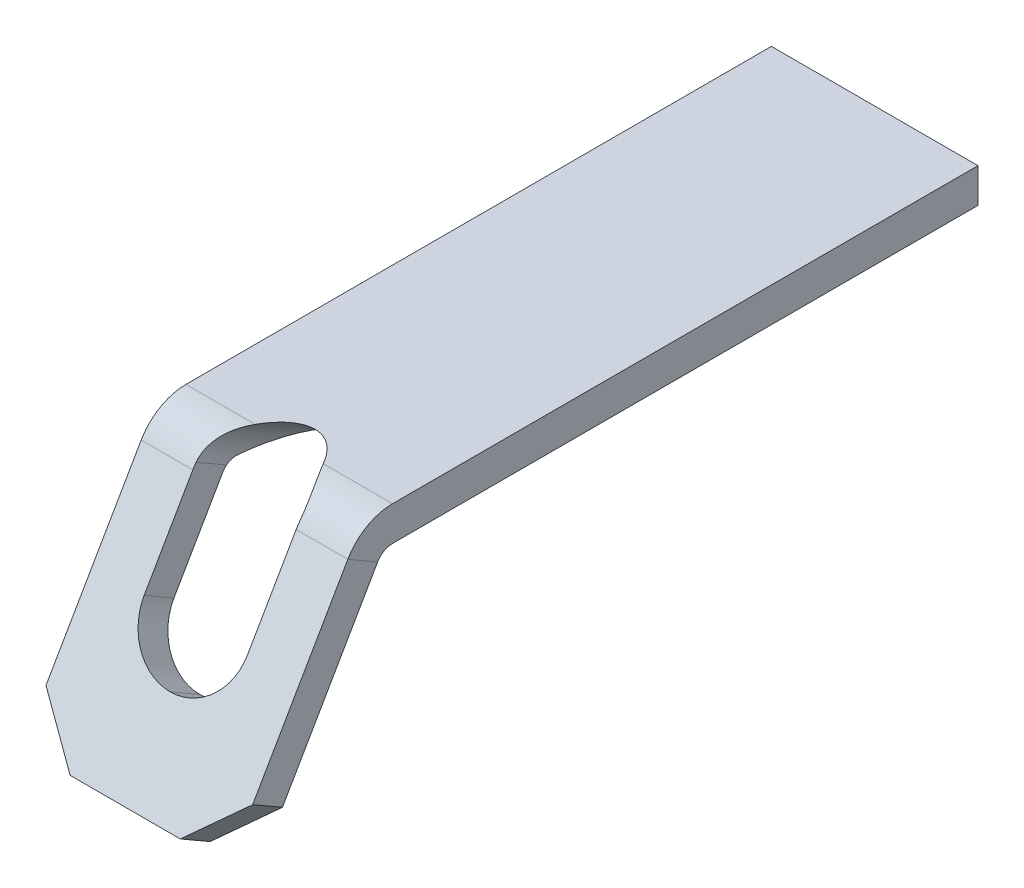
ISO-10303-21;
HEADER;
FILE_DESCRIPTION(('STEP AP214'),'2;1');
FILE_NAME('part.step','',(''),(''),'','','');
FILE_SCHEMA(('AUTOMOTIVE_DESIGN { 1 0 10303 214 1 1 1 1 }'));
ENDSEC;
DATA;
#1=APPLICATION_CONTEXT('core data for automotive mechanical design processes');
#2=APPLICATION_PROTOCOL_DEFINITION('international standard','automotive_design',2000,#1);
#3=PRODUCT_CONTEXT('',#1,'mechanical');
#4=PRODUCT('Part','Part','',(#3));
#5=PRODUCT_RELATED_PRODUCT_CATEGORY('part','',(#4));
#6=PRODUCT_DEFINITION_FORMATION('','',#4);
#7=PRODUCT_DEFINITION_CONTEXT('part definition',#1,'design');
#8=PRODUCT_DEFINITION('design','',#6,#7);
#9=PRODUCT_DEFINITION_SHAPE('','',#8);
#10=(LENGTH_UNIT() NAMED_UNIT(*) SI_UNIT(.MILLI.,.METRE.));
#11=(NAMED_UNIT(*) PLANE_ANGLE_UNIT() SI_UNIT($,.RADIAN.));
#12=(NAMED_UNIT(*) SI_UNIT($,.STERADIAN.) SOLID_ANGLE_UNIT());
#13=UNCERTAINTY_MEASURE_WITH_UNIT(LENGTH_MEASURE(1.E-05),#10,'distance_accuracy_value','');
#14=(GEOMETRIC_REPRESENTATION_CONTEXT(3) GLOBAL_UNCERTAINTY_ASSIGNED_CONTEXT((#13)) GLOBAL_UNIT_ASSIGNED_CONTEXT((#10,
#11,#12)) REPRESENTATION_CONTEXT('',''));
#15=CARTESIAN_POINT('',(0.,0.,0.));
#16=DIRECTION('',(0.,0.,1.));
#17=DIRECTION('',(1.,0.,0.));
#18=AXIS2_PLACEMENT_3D('',#15,#16,#17);
#19=CARTESIAN_POINT('',(-0.8,-3.25,6.41506350946111));
#20=DIRECTION('',(0.707106781186549,0.612372435695793,-0.353553390593274));
#21=DIRECTION('',(0.,-0.5,-0.866025403784438));
#22=AXIS2_PLACEMENT_3D('',#19,#20,#21);
#23=PLANE('',#22);
#24=DIRECTION('',(0.707106781186546,-0.612372435695796,0.353553390593276));
#25=VECTOR('',#24,1.);
#26=CARTESIAN_POINT('',(-1.38205080756888,-2.6209292143521,6.34054445662277));
#27=LINE('',#26,#25);
#28=CARTESIAN_POINT('',(-1.5,-2.51878221735089,6.28156986040721));
#29=VERTEX_POINT('',#28);
#30=CARTESIAN_POINT('',(-0.8,-3.125,6.63156986040721));
#31=VERTEX_POINT('',#30);
#32=EDGE_CURVE('E229',#29,#31,#27,.T.);
#33=ORIENTED_EDGE('',*,*,#32,.F.);
#34=DIRECTION('',(0.,0.5,0.866025403784438));
#35=VECTOR('',#34,1.);
#36=CARTESIAN_POINT('',(-1.5,-2.51878221735089,6.28156986040721));
#37=LINE('',#36,#35);
#38=CARTESIAN_POINT('',(-1.5,-2.76878221735089,5.84855715851499));
#39=VERTEX_POINT('',#38);
#40=EDGE_CURVE('E122',#39,#29,#37,.T.);
#41=ORIENTED_EDGE('',*,*,#40,.F.);
#42=DIRECTION('',(-0.707106781186546,0.612372435695796,-0.353553390593276));
#43=VECTOR('',#42,1.);
#44=CARTESIAN_POINT('',(-2.88205080756888,-1.57189110867544,5.15753175473055));
#45=LINE('',#44,#43);
#46=CARTESIAN_POINT('',(-0.8,-3.375,6.198557158515));
#47=VERTEX_POINT('',#46);
#48=EDGE_CURVE('E232',#47,#39,#45,.T.);
#49=ORIENTED_EDGE('',*,*,#48,.F.);
#50=DIRECTION('',(0.,-0.5,-0.866025403784438));
#51=VECTOR('',#50,1.);
#52=CARTESIAN_POINT('',(-0.8,-3.25,6.41506350946111));
#53=LINE('',#52,#51);
#54=EDGE_CURVE('E227',#31,#47,#53,.T.);
#55=ORIENTED_EDGE('',*,*,#54,.F.);
#56=EDGE_LOOP('',(#33,#41,#49,#55));
#57=FACE_BOUND('',#56,.T.);
#58=ADVANCED_FACE('F17',(#57),#23,.F.);
#59=CARTESIAN_POINT('',(0.8,-3.25,6.41506350946111));
#60=DIRECTION('',(-0.707106781186549,0.612372435695793,-0.353553390593274));
#61=DIRECTION('',(-0.447213595499957,0.,0.894427190999916));
#62=AXIS2_PLACEMENT_3D('',#59,#60,#61);
#63=PLANE('',#62);
#64=DIRECTION('',(-0.707106781186546,-0.612372435695796,0.353553390593276));
#65=VECTOR('',#64,1.);
#66=CARTESIAN_POINT('',(1.38205080756888,-2.8709292143521,5.90753175473055));
#67=LINE('',#66,#65);
#68=CARTESIAN_POINT('',(1.5,-2.76878221735089,5.84855715851499));
#69=VERTEX_POINT('',#68);
#70=CARTESIAN_POINT('',(0.8,-3.375,6.198557158515));
#71=VERTEX_POINT('',#70);
#72=EDGE_CURVE('E268',#69,#71,#67,.T.);
#73=ORIENTED_EDGE('',*,*,#72,.F.);
#74=DIRECTION('',(0.,-0.5,-0.866025403784438));
#75=VECTOR('',#74,1.);
#76=CARTESIAN_POINT('',(1.5,-2.76878221735089,5.84855715851499));
#77=LINE('',#76,#75);
#78=CARTESIAN_POINT('',(1.5,-2.51878221735089,6.28156986040721));
#79=VERTEX_POINT('',#78);
#80=EDGE_CURVE('E244',#79,#69,#77,.T.);
#81=ORIENTED_EDGE('',*,*,#80,.F.);
#82=DIRECTION('',(0.707106781186546,0.612372435695796,-0.353553390593276));
#83=VECTOR('',#82,1.);
#84=CARTESIAN_POINT('',(2.88205080756888,-1.32189110867544,5.59054445662277));
#85=LINE('',#84,#83);
#86=CARTESIAN_POINT('',(0.8,-3.125,6.63156986040721));
#87=VERTEX_POINT('',#86);
#88=EDGE_CURVE('E248',#87,#79,#85,.T.);
#89=ORIENTED_EDGE('',*,*,#88,.F.);
#90=DIRECTION('',(0.,0.5,0.866025403784438));
#91=VECTOR('',#90,1.);
#92=CARTESIAN_POINT('',(0.8,-3.25,6.41506350946111));
#93=LINE('',#92,#91);
#94=EDGE_CURVE('E219',#71,#87,#93,.T.);
#95=ORIENTED_EDGE('',*,*,#94,.F.);
#96=EDGE_LOOP('',(#73,#81,#89,#95));
#97=FACE_BOUND('',#96,.T.);
#98=ADVANCED_FACE('F466',(#97),#63,.F.);
#99=CARTESIAN_POINT('',(-0.75,-4.82496778264912,-3.41286071037125));
#100=DIRECTION('',(-1.,0.,0.));
#101=DIRECTION('',(0.,1.,0.));
#102=AXIS2_PLACEMENT_3D('',#99,#100,#101);
#103=PLANE('',#102);
#104=CARTESIAN_POINT('',(-0.75,-0.5,4.25));
#105=DIRECTION('',(1.,0.,0.));
#106=DIRECTION('',(0.,-1.,0.));
#107=AXIS2_PLACEMENT_3D('',#104,#105,#106);
#108=CIRCLE('',#107,0.75);
#109=CARTESIAN_POINT('',(-0.75,-0.0530774463348061,4.85229580027208));
#110=VERTEX_POINT('',#109);
#111=CARTESIAN_POINT('',(-0.75,-0.125,4.89951905283833));
#112=VERTEX_POINT('',#111);
#113=EDGE_CURVE('E135',#110,#112,#108,.T.);
#114=ORIENTED_EDGE('',*,*,#113,.T.);
#115=DIRECTION('',(0.,-0.866025403784438,0.5));
#116=VECTOR('',#115,1.);
#117=CARTESIAN_POINT('',(-0.75,-0.125,4.89951905283833));
#118=LINE('',#117,#116);
#119=CARTESIAN_POINT('',(-0.75,-1.3496479222419,5.60656986040721));
#120=VERTEX_POINT('',#119);
#121=EDGE_CURVE('E281',#112,#120,#118,.T.);
#122=ORIENTED_EDGE('',*,*,#121,.T.);
#123=DIRECTION('',(0.,0.5,0.866025403784438));
#124=VECTOR('',#123,1.);
#125=CARTESIAN_POINT('',(-0.75,-6.12400588832578,-2.66286071037125));
#126=LINE('',#125,#124);
#127=CARTESIAN_POINT('',(-0.75,-1.5996479222419,5.17355715851499));
#128=VERTEX_POINT('',#127);
#129=EDGE_CURVE('E11',#128,#120,#126,.T.);
#130=ORIENTED_EDGE('',*,*,#129,.F.);
#131=DIRECTION('',(0.,0.866025403784438,-0.5));
#132=VECTOR('',#131,1.);
#133=CARTESIAN_POINT('',(-0.75,-0.375,4.46650635094611));
#134=LINE('',#133,#132);
#135=CARTESIAN_POINT('',(-0.75,-0.375,4.46650635094611));
#136=VERTEX_POINT('',#135);
#137=EDGE_CURVE('E342',#128,#136,#134,.T.);
#138=ORIENTED_EDGE('',*,*,#137,.T.);
#139=CARTESIAN_POINT('',(-0.75,-0.5,4.25));
#140=DIRECTION('',(-1.,0.,0.));
#141=DIRECTION('',(0.,-1.,0.));
#142=AXIS2_PLACEMENT_3D('',#139,#140,#141);
#143=CIRCLE('',#142,0.25);
#144=CARTESIAN_POINT('',(-0.75,-0.308220009215911,4.41037591818866));
#145=VERTEX_POINT('',#144);
#146=EDGE_CURVE('E294',#136,#145,#143,.T.);
#147=ORIENTED_EDGE('',*,*,#146,.T.);
#148=DIRECTION('',(0.,0.5,0.866025403784438));
#149=VECTOR('',#148,1.);
#150=CARTESIAN_POINT('',(-0.75,-4.82496778264912,-3.41286071037125));
#151=LINE('',#150,#149);
#152=EDGE_CURVE('E34',#145,#110,#151,.T.);
#153=ORIENTED_EDGE('',*,*,#152,.T.);
#154=EDGE_LOOP('',(#114,#122,#130,#138,#147,#153));
#155=FACE_BOUND('',#154,.T.);
#156=ADVANCED_FACE('F464',(#155),#103,.F.);
#157=CARTESIAN_POINT('',(0.,-6.12400588832578,-2.66286071037125));
#158=DIRECTION('',(0.,0.5,0.866025403784438));
#159=DIRECTION('',(0.,-0.866025403784438,0.5));
#160=AXIS2_PLACEMENT_3D('',#157,#158,#159);
#161=CYLINDRICAL_SURFACE('',#160,0.75);
#162=DIRECTION('',(0.,0.5,0.866025403784438));
#163=VECTOR('',#162,1.);
#164=CARTESIAN_POINT('',(0.,-6.77352494116411,-2.28786071037125));
#165=LINE('',#164,#163);
#166=CARTESIAN_POINT('',(0.,-2.24916697508023,5.54855715851499));
#167=VERTEX_POINT('',#166);
#168=CARTESIAN_POINT('',(0.,-1.99916697508023,5.98156986040721));
#169=VERTEX_POINT('',#168);
#170=EDGE_CURVE('E269',#167,#169,#165,.T.);
#171=ORIENTED_EDGE('',*,*,#170,.F.);
#172=CARTESIAN_POINT('',(0.,-1.59964792224191,5.17355715851499));
#173=DIRECTION('',(0.,-0.5,-0.866025403784438));
#174=DIRECTION('',(0.,0.866025403784438,-0.5));
#175=AXIS2_PLACEMENT_3D('',#172,#173,#174);
#176=CIRCLE('',#175,0.75);
#177=EDGE_CURVE('E338',#167,#128,#176,.T.);
#178=ORIENTED_EDGE('',*,*,#177,.T.);
#179=ORIENTED_EDGE('',*,*,#129,.T.);
#180=CARTESIAN_POINT('',(0.,-1.3496479222419,5.60656986040721));
#181=DIRECTION('',(0.,0.5,0.866025403784438));
#182=DIRECTION('',(0.,-0.866025403784438,0.5));
#183=AXIS2_PLACEMENT_3D('',#180,#181,#182);
#184=CIRCLE('',#183,0.75);
#185=EDGE_CURVE('E284',#120,#169,#184,.T.);
#186=ORIENTED_EDGE('',*,*,#185,.T.);
#187=EDGE_LOOP('',(#171,#178,#179,#186));
#188=FACE_BOUND('',#187,.T.);
#189=ADVANCED_FACE('F462',(#188),#161,.F.);
#190=CARTESIAN_POINT('',(0.75,-4.82496778264912,-3.41286071037125));
#191=DIRECTION('',(1.,0.,0.));
#192=DIRECTION('',(0.,1.,0.));
#193=AXIS2_PLACEMENT_3D('',#190,#191,#192);
#194=PLANE('',#193);
#195=CARTESIAN_POINT('',(0.75,-0.5,4.25));
#196=DIRECTION('',(-1.,0.,0.));
#197=DIRECTION('',(0.,0.,-1.));
#198=AXIS2_PLACEMENT_3D('',#195,#196,#197);
#199=CIRCLE('',#198,0.75);
#200=CARTESIAN_POINT('',(0.75,-0.125,4.89951905283833));
#201=VERTEX_POINT('',#200);
#202=CARTESIAN_POINT('',(0.75,-0.0530774463348061,4.85229580027208));
#203=VERTEX_POINT('',#202);
#204=EDGE_CURVE('E309',#201,#203,#199,.T.);
#205=ORIENTED_EDGE('',*,*,#204,.T.);
#206=DIRECTION('',(0.,0.5,0.866025403784438));
#207=VECTOR('',#206,1.);
#208=CARTESIAN_POINT('',(0.75,-4.82496778264912,-3.41286071037125));
#209=LINE('',#208,#207);
#210=CARTESIAN_POINT('',(0.75,-0.308220009215911,4.41037591818866));
#211=VERTEX_POINT('',#210);
#212=EDGE_CURVE('E235',#211,#203,#209,.T.);
#213=ORIENTED_EDGE('',*,*,#212,.F.);
#214=CARTESIAN_POINT('',(0.75,-0.5,4.25));
#215=DIRECTION('',(1.,0.,0.));
#216=DIRECTION('',(0.,0.,-1.));
#217=AXIS2_PLACEMENT_3D('',#214,#215,#216);
#218=CIRCLE('',#217,0.25);
#219=CARTESIAN_POINT('',(0.75,-0.375,4.46650635094611));
#220=VERTEX_POINT('',#219);
#221=EDGE_CURVE('E305',#211,#220,#218,.T.);
#222=ORIENTED_EDGE('',*,*,#221,.T.);
#223=DIRECTION('',(0.,-0.866025403784438,0.5));
#224=VECTOR('',#223,1.);
#225=CARTESIAN_POINT('',(0.75,-0.375,4.46650635094611));
#226=LINE('',#225,#224);
#227=CARTESIAN_POINT('',(0.75,-1.59964792224191,5.17355715851499));
#228=VERTEX_POINT('',#227);
#229=EDGE_CURVE('E341',#220,#228,#226,.T.);
#230=ORIENTED_EDGE('',*,*,#229,.T.);
#231=DIRECTION('',(0.,0.5,0.866025403784438));
#232=VECTOR('',#231,1.);
#233=CARTESIAN_POINT('',(0.75,-6.12400588832578,-2.66286071037125));
#234=LINE('',#233,#232);
#235=CARTESIAN_POINT('',(0.75,-1.3496479222419,5.60656986040721));
#236=VERTEX_POINT('',#235);
#237=EDGE_CURVE('E346',#228,#236,#234,.T.);
#238=ORIENTED_EDGE('',*,*,#237,.T.);
#239=DIRECTION('',(0.,0.866025403784438,-0.5));
#240=VECTOR('',#239,1.);
#241=CARTESIAN_POINT('',(0.75,-0.0506098165652452,4.85656986040721));
#242=LINE('',#241,#240);
#243=EDGE_CURVE('E97',#236,#201,#242,.T.);
#244=ORIENTED_EDGE('',*,*,#243,.T.);
#245=EDGE_LOOP('',(#205,#213,#222,#230,#238,#244));
#246=FACE_BOUND('',#245,.T.);
#247=ADVANCED_FACE('F460',(#246),#194,.F.);
#248=CARTESIAN_POINT('',(0.,-4.82496778264912,-3.41286071037125));
#249=DIRECTION('',(0.,0.5,0.866025403784438));
#250=DIRECTION('',(0.,-0.866025403784438,0.5));
#251=AXIS2_PLACEMENT_3D('',#248,#249,#250);
#252=CYLINDRICAL_SURFACE('',#251,0.75);
#253=CARTESIAN_POINT('',(0.738540154084687,-0.25,4.25));
#254=CARTESIAN_POINT('',(0.739796227190585,-0.249992222476748,4.26423192600012));
#255=CARTESIAN_POINT('',(0.741136393695473,-0.251215674942695,4.27845228618072));
#256=CARTESIAN_POINT('',(0.743704492818734,-0.255982139403662,4.30608304503191));
#257=CARTESIAN_POINT('',(0.74493454642555,-0.2594573169147,4.31950497559517));
#258=CARTESIAN_POINT('',(0.747172335123278,-0.268891956089954,4.34646595481917));
#259=CARTESIAN_POINT('',(0.748160348429002,-0.274998607282581,4.35995559261057));
#260=CARTESIAN_POINT('',(0.749588900459598,-0.289725386987503,4.38608332336731));
#261=CARTESIAN_POINT('',(0.750011148585141,-0.298418856822308,4.39868102665239));
#262=CARTESIAN_POINT('',(0.75,-0.308220009215909,4.41037591818866));
#263=B_SPLINE_CURVE_WITH_KNOTS('',3,(#253,#254,#255,#256,#257,#258,#259,#260,#261,#262),
.UNSPECIFIED.,.F.,.F.,(4,2,2,2,4),(0.,0.0428026914059938,0.0843723717900829,0.128652135829097,
0.174331417159321),.UNSPECIFIED.);
#264=CARTESIAN_POINT('',(0.738540154084689,-0.25,4.25));
#265=VERTEX_POINT('',#264);
#266=EDGE_CURVE('E21',#265,#211,#263,.T.);
#267=ORIENTED_EDGE('',*,*,#266,.T.);
#268=ORIENTED_EDGE('',*,*,#212,.T.);
#269=CARTESIAN_POINT('',(0.75,-0.0530774463347974,4.85229580027207));
#270=CARTESIAN_POINT('',(0.750002475309161,-0.0390500007812516,4.84189012408484));
#271=CARTESIAN_POINT('',(0.749397484850658,-0.0253996458115984,4.83099771523583));
#272=CARTESIAN_POINT('',(0.747030547301497,0.00104006971930926,4.8083555069125));
#273=CARTESIAN_POINT('',(0.745269813605594,0.0138303177827581,4.79660661812891));
#274=CARTESIAN_POINT('',(0.738388136393957,0.0505308719127293,4.76047370160619));
#275=CARTESIAN_POINT('',(0.731665075692411,0.0730740166895028,4.73497676608455));
#276=CARTESIAN_POINT('',(0.714670479663488,0.113924752364811,4.68210224166803));
#277=CARTESIAN_POINT('',(0.704412929418577,0.132248568388788,4.65473240041221));
#278=CARTESIAN_POINT('',(0.681092480512212,0.164811508788654,4.59868326911694));
#279=CARTESIAN_POINT('',(0.668020265449985,0.179036692146177,4.56999988576025));
#280=CARTESIAN_POINT('',(0.633617683474323,0.208863537901701,4.49914580377907));
#281=CARTESIAN_POINT('',(0.611187373419903,0.222307050936849,4.45660414355653));
#282=CARTESIAN_POINT('',(0.564129396140931,0.241456718121172,4.37110856302408));
#283=CARTESIAN_POINT('',(0.539503361307696,0.247168570016326,4.32815496981809));
#284=CARTESIAN_POINT('',(0.508168812013796,0.249724148600028,4.27340370863222));
#285=CARTESIAN_POINT('',(0.501476538124159,0.249996949131605,4.26170462495713));
#286=CARTESIAN_POINT('',(0.494804752028702,0.250000000000006,4.25));
#287=B_SPLINE_CURVE_WITH_KNOTS('',3,(#269,#270,#271,#272,#273,#274,#275,#276,#277,#278,#279,
#280,#281,#282,#283,#284,#285,#286),.UNSPECIFIED.,.F.,.F.,(4,2,2,2,2,2,2,2,4),(0.,
0.0523524240966634,0.104649972016484,0.208128032232245,0.311201270134962,0.414621068926404,
0.563636486235147,0.712542028697269,0.752971410406563),.UNSPECIFIED.);
#288=CARTESIAN_POINT('',(0.494804752028703,0.25,4.25));
#289=VERTEX_POINT('',#288);
#290=EDGE_CURVE('E415',#203,#289,#287,.T.);
#291=ORIENTED_EDGE('',*,*,#290,.T.);
#292=CARTESIAN_POINT('',(0.494804752028707,0.25,4.25));
#293=CARTESIAN_POINT('',(0.19768559157222,0.25,3.72831589270645));
#294=CARTESIAN_POINT('',(-0.19768559157222,0.25,3.72831589270645));
#295=CARTESIAN_POINT('',(-0.494804752028708,0.25,4.25));
#296=(BOUNDED_CURVE() B_SPLINE_CURVE(3,(#292,#293,#294,#295),.UNSPECIFIED.,.F.,
.F.) B_SPLINE_CURVE_WITH_KNOTS((4,4),(2.42112036275681,3.86206494442277),
.UNSPECIFIED.) CURVE() GEOMETRIC_REPRESENTATION_ITEM() RATIONAL_B_SPLINE_CURVE((1.,
0.83432948264541,0.83432948264541,1.)) REPRESENTATION_ITEM(''));
#297=CARTESIAN_POINT('',(-0.494804752028704,0.25,4.25));
#298=VERTEX_POINT('',#297);
#299=EDGE_CURVE('E397',#289,#298,#296,.T.);
#300=ORIENTED_EDGE('',*,*,#299,.T.);
#301=CARTESIAN_POINT('',(-0.4948047520287,0.25,4.25));
#302=CARTESIAN_POINT('',(-0.507212223849987,0.249991049365019,4.27176544478383));
#303=CARTESIAN_POINT('',(-0.519677329562974,0.249052174133644,4.29348153759597));
#304=CARTESIAN_POINT('',(-0.544476505895977,0.24527381917675,4.33686353730329));
#305=CARTESIAN_POINT('',(-0.55681036406553,0.242431628285438,4.35852932830796));
#306=CARTESIAN_POINT('',(-0.593492984984997,0.230897623169132,4.42397071088134));
#307=CARTESIAN_POINT('',(-0.617199549117092,0.219196023208875,4.46764754407431));
#308=CARTESIAN_POINT('',(-0.655369353049867,0.191156681794534,4.54326612847591));
#309=CARTESIAN_POINT('',(-0.670675057728901,0.176653514513335,4.57546468892483));
#310=CARTESIAN_POINT('',(-0.697958612412821,0.142647605295803,4.63828922937358));
#311=CARTESIAN_POINT('',(-0.709962128742349,0.12318582728029,4.66892573721419));
#312=CARTESIAN_POINT('',(-0.729340509733131,0.0800406667948636,4.72675752132392));
#313=CARTESIAN_POINT('',(-0.736878604418716,0.0565530386505944,4.75404068185705));
#314=CARTESIAN_POINT('',(-0.744635583122394,0.0179834450445735,4.79270929564723));
#315=CARTESIAN_POINT('',(-0.746630830911751,0.0044493651240259,4.80531366677174));
#316=CARTESIAN_POINT('',(-0.749315579530813,-0.0236048687245391,4.82956257178275));
#317=CARTESIAN_POINT('',(-0.750003338619623,-0.0381263113268359,4.84120580560175));
#318=CARTESIAN_POINT('',(-0.75,-0.0530774463347972,4.85229580027207));
#319=B_SPLINE_CURVE_WITH_KNOTS('',3,(#301,#302,#303,#304,#305,#306,#307,#308,#309,#310,#311,
#312,#313,#314,#315,#316,#317,#318),.UNSPECIFIED.,.F.,.F.,(4,2,2,2,2,2,2,2,4),(0.,
0.0751135104377861,0.150334244069228,0.302651785589941,0.417705443137116,0.531837811097349,
0.641489009411776,0.697207014432037,0.752999191038589),.UNSPECIFIED.);
#320=EDGE_CURVE('E409',#298,#110,#319,.T.);
#321=ORIENTED_EDGE('',*,*,#320,.T.);
#322=ORIENTED_EDGE('',*,*,#152,.F.);
#323=CARTESIAN_POINT('',(-0.75,-0.308220009215909,4.41037591818866));
#324=CARTESIAN_POINT('',(-0.750008310530121,-0.299170345690206,4.39957110118343));
#325=CARTESIAN_POINT('',(-0.7496493719506,-0.291061551564701,4.38799997393136));
#326=CARTESIAN_POINT('',(-0.748415678099862,-0.277104423632904,4.36403100034418));
#327=CARTESIAN_POINT('',(-0.747555891577426,-0.271198332145318,4.35166604883466));
#328=CARTESIAN_POINT('',(-0.745421239101966,-0.261037124809498,4.32496342703672));
#329=CARTESIAN_POINT('',(-0.7441150102834,-0.256988760900443,4.31054949871758));
#330=CARTESIAN_POINT('',(-0.741355473168161,-0.25142101625551,4.28077071335262));
#331=CARTESIAN_POINT('',(-0.739898791250123,-0.249986913345264,4.26539018443887));
#332=CARTESIAN_POINT('',(-0.738540154084687,-0.25,4.25));
#333=B_SPLINE_CURVE_WITH_KNOTS('',3,(#323,#324,#325,#326,#327,#328,#329,#330,#331,#332),
.UNSPECIFIED.,.F.,.F.,(4,2,2,2,4),(0.,0.0422016336722638,0.0832023760305242,0.128047888733354,
0.174331752280167),.UNSPECIFIED.);
#334=CARTESIAN_POINT('',(-0.738540154084688,-0.25,4.25));
#335=VERTEX_POINT('',#334);
#336=EDGE_CURVE('E384',#145,#335,#333,.T.);
#337=ORIENTED_EDGE('',*,*,#336,.T.);
#338=CARTESIAN_POINT('',(0.738540154084688,-0.25,4.25));
#339=CARTESIAN_POINT('',(0.547761460182016,-0.25,2.09243288957612));
#340=CARTESIAN_POINT('',(-0.547761460182015,-0.25,2.09243288957611));
#341=CARTESIAN_POINT('',(-0.738540154084688,-0.25,4.25));
#342=(BOUNDED_CURVE() B_SPLINE_CURVE(3,(#338,#339,#340,#341),.UNSPECIFIED.,.F.,
.F.) B_SPLINE_CURVE_WITH_KNOTS((4,4),(1.74583269963411,4.53735260754547),
.UNSPECIFIED.) CURVE() GEOMETRIC_REPRESENTATION_ITEM() RATIONAL_B_SPLINE_CURVE((1.,
0.44942930318566,0.44942930318566,1.)) REPRESENTATION_ITEM(''));
#343=EDGE_CURVE('E82',#265,#335,#342,.T.);
#344=ORIENTED_EDGE('',*,*,#343,.F.);
#345=EDGE_LOOP('',(#267,#268,#291,#300,#321,#322,#337,#344));
#346=FACE_BOUND('',#345,.T.);
#347=ADVANCED_FACE('F437',(#346),#252,.F.);
#348=CARTESIAN_POINT('',(0.,-3.25,6.41506350946111));
#349=DIRECTION('',(0.,-0.866025403784438,0.5));
#350=DIRECTION('',(-1.,0.,0.));
#351=AXIS2_PLACEMENT_3D('',#348,#349,#350);
#352=PLANE('',#351);
#353=DIRECTION('',(1.,0.,0.));
#354=VECTOR('',#353,1.);
#355=CARTESIAN_POINT('',(-1.5,-3.375,6.198557158515));
#356=LINE('',#355,#354);
#357=EDGE_CURVE('E265',#47,#71,#356,.T.);
#358=ORIENTED_EDGE('',*,*,#357,.T.);
#359=ORIENTED_EDGE('',*,*,#94,.T.);
#360=DIRECTION('',(-1.,0.,0.));
#361=VECTOR('',#360,1.);
#362=CARTESIAN_POINT('',(1.5,-3.125,6.63156986040721));
#363=LINE('',#362,#361);
#364=EDGE_CURVE('E240',#87,#31,#363,.T.);
#365=ORIENTED_EDGE('',*,*,#364,.T.);
#366=ORIENTED_EDGE('',*,*,#54,.T.);
#367=EDGE_LOOP('',(#358,#359,#365,#366));
#368=FACE_BOUND('',#367,.T.);
#369=ADVANCED_FACE('F246',(#368),#352,.T.);
#370=CARTESIAN_POINT('',(0.,-0.5,4.25));
#371=DIRECTION('',(1.,0.,0.));
#372=DIRECTION('',(0.,0.,-1.));
#373=AXIS2_PLACEMENT_3D('',#370,#371,#372);
#374=CYLINDRICAL_SURFACE('',#373,0.25);
#375=ORIENTED_EDGE('',*,*,#336,.F.);
#376=ORIENTED_EDGE('',*,*,#146,.F.);
#377=DIRECTION('',(1.,0.,0.));
#378=VECTOR('',#377,1.);
#379=CARTESIAN_POINT('',(-1.5,-0.375,4.46650635094611));
#380=LINE('',#379,#378);
#381=CARTESIAN_POINT('',(-1.5,-0.375,4.46650635094611));
#382=VERTEX_POINT('',#381);
#383=EDGE_CURVE('E377',#382,#136,#380,.T.);
#384=ORIENTED_EDGE('',*,*,#383,.F.);
#385=CARTESIAN_POINT('',(-1.5,-0.5,4.25));
#386=DIRECTION('',(1.,0.,0.));
#387=DIRECTION('',(0.,1.,0.));
#388=AXIS2_PLACEMENT_3D('',#385,#386,#387);
#389=CIRCLE('',#388,0.25);
#390=CARTESIAN_POINT('',(-1.5,-0.25,4.25));
#391=VERTEX_POINT('',#390);
#392=EDGE_CURVE('E310',#391,#382,#389,.T.);
#393=ORIENTED_EDGE('',*,*,#392,.F.);
#394=DIRECTION('',(1.,0.,0.));
#395=VECTOR('',#394,1.);
#396=CARTESIAN_POINT('',(-1.5,-0.25,4.25));
#397=LINE('',#396,#395);
#398=EDGE_CURVE('E249',#391,#335,#397,.T.);
#399=ORIENTED_EDGE('',*,*,#398,.T.);
#400=EDGE_LOOP('',(#375,#376,#384,#393,#399));
#401=FACE_BOUND('',#400,.T.);
#402=ADVANCED_FACE('F441',(#401),#374,.F.);
#403=CARTESIAN_POINT('',(0.,-0.5,4.25));
#404=DIRECTION('',(1.,0.,0.));
#405=DIRECTION('',(0.,0.,-1.));
#406=AXIS2_PLACEMENT_3D('',#403,#404,#405);
#407=CYLINDRICAL_SURFACE('',#406,0.75);
#408=ORIENTED_EDGE('',*,*,#320,.F.);
#409=DIRECTION('',(1.,0.,0.));
#410=VECTOR('',#409,1.);
#411=CARTESIAN_POINT('',(-1.5,0.25,4.25));
#412=LINE('',#411,#410);
#413=CARTESIAN_POINT('',(-1.5,0.25,4.25));
#414=VERTEX_POINT('',#413);
#415=EDGE_CURVE('E390',#414,#298,#412,.T.);
#416=ORIENTED_EDGE('',*,*,#415,.F.);
#417=CARTESIAN_POINT('',(-1.5,-0.5,4.25));
#418=DIRECTION('',(1.,0.,0.));
#419=DIRECTION('',(0.,1.,0.));
#420=AXIS2_PLACEMENT_3D('',#417,#418,#419);
#421=CIRCLE('',#420,0.75);
#422=CARTESIAN_POINT('',(-1.5,-0.125,4.89951905283833));
#423=VERTEX_POINT('',#422);
#424=EDGE_CURVE('E263',#414,#423,#421,.T.);
#425=ORIENTED_EDGE('',*,*,#424,.T.);
#426=DIRECTION('',(-1.,0.,0.));
#427=VECTOR('',#426,1.);
#428=CARTESIAN_POINT('',(1.5,-0.125,4.89951905283833));
#429=LINE('',#428,#427);
#430=EDGE_CURVE('E283',#112,#423,#429,.T.);
#431=ORIENTED_EDGE('',*,*,#430,.F.);
#432=ORIENTED_EDGE('',*,*,#113,.F.);
#433=EDGE_LOOP('',(#408,#416,#425,#431,#432));
#434=FACE_BOUND('',#433,.T.);
#435=ADVANCED_FACE('F446',(#434),#407,.T.);
#436=CARTESIAN_POINT('',(-1.5,-0.125,4.89951905283833));
#437=DIRECTION('',(-1.,0.,0.));
#438=DIRECTION('',(0.,0.,1.));
#439=AXIS2_PLACEMENT_3D('',#436,#437,#438);
#440=PLANE('',#439);
#441=DIRECTION('',(0.,-0.866025403784438,0.5));
#442=VECTOR('',#441,1.);
#443=CARTESIAN_POINT('',(-1.5,-0.375,4.46650635094611));
#444=LINE('',#443,#442);
#445=EDGE_CURVE('E323',#382,#39,#444,.T.);
#446=ORIENTED_EDGE('',*,*,#445,.T.);
#447=ORIENTED_EDGE('',*,*,#40,.T.);
#448=DIRECTION('',(0.,-0.866025403784438,0.5));
#449=VECTOR('',#448,1.);
#450=CARTESIAN_POINT('',(-1.5,-0.125,4.89951905283833));
#451=LINE('',#450,#449);
#452=EDGE_CURVE('E242',#423,#29,#451,.T.);
#453=ORIENTED_EDGE('',*,*,#452,.F.);
#454=DIRECTION('',(0.,-0.5,-0.866025403784439));
#455=VECTOR('',#454,1.);
#456=CARTESIAN_POINT('',(-1.5,-0.125,4.89951905283833));
#457=LINE('',#456,#455);
#458=EDGE_CURVE('E314',#423,#382,#457,.T.);
#459=ORIENTED_EDGE('',*,*,#458,.T.);
#460=EDGE_LOOP('',(#446,#447,#453,#459));
#461=FACE_BOUND('',#460,.T.);
#462=ADVANCED_FACE('F481',(#461),#440,.T.);
#463=CARTESIAN_POINT('',(-1.5,-0.375,4.46650635094611));
#464=DIRECTION('',(0.,-0.5,-0.866025403784438));
#465=DIRECTION('',(0.,-0.866025403784438,0.5));
#466=AXIS2_PLACEMENT_3D('',#463,#464,#465);
#467=PLANE('',#466);
#468=DIRECTION('',(0.,-0.866025403784438,0.5));
#469=VECTOR('',#468,1.);
#470=CARTESIAN_POINT('',(1.5,-0.375,4.46650635094611));
#471=LINE('',#470,#469);
#472=CARTESIAN_POINT('',(1.5,-0.375,4.46650635094611));
#473=VERTEX_POINT('',#472);
#474=EDGE_CURVE('E288',#473,#69,#471,.T.);
#475=ORIENTED_EDGE('',*,*,#474,.T.);
#476=ORIENTED_EDGE('',*,*,#72,.T.);
#477=ORIENTED_EDGE('',*,*,#357,.F.);
#478=ORIENTED_EDGE('',*,*,#48,.T.);
#479=ORIENTED_EDGE('',*,*,#445,.F.);
#480=ORIENTED_EDGE('',*,*,#383,.T.);
#481=ORIENTED_EDGE('',*,*,#137,.F.);
#482=ORIENTED_EDGE('',*,*,#177,.F.);
#483=CARTESIAN_POINT('',(0.,-1.59964792224191,5.17355715851499));
#484=DIRECTION('',(0.,-0.5,-0.866025403784438));
#485=DIRECTION('',(0.,0.866025403784438,-0.5));
#486=AXIS2_PLACEMENT_3D('',#483,#484,#485);
#487=CIRCLE('',#486,0.75);
#488=EDGE_CURVE('E274',#228,#167,#487,.T.);
#489=ORIENTED_EDGE('',*,*,#488,.F.);
#490=ORIENTED_EDGE('',*,*,#229,.F.);
#491=DIRECTION('',(1.,0.,0.));
#492=VECTOR('',#491,1.);
#493=CARTESIAN_POINT('',(-1.5,-0.375,4.46650635094611));
#494=LINE('',#493,#492);
#495=EDGE_CURVE('E301',#220,#473,#494,.T.);
#496=ORIENTED_EDGE('',*,*,#495,.T.);
#497=EDGE_LOOP('',(#475,#476,#477,#478,#479,#480,#481,#482,#489,#490,#496));
#498=FACE_BOUND('',#497,.T.);
#499=ADVANCED_FACE('F485',(#498),#467,.T.);
#500=CARTESIAN_POINT('',(1.5,-0.375,4.46650635094611));
#501=DIRECTION('',(1.,0.,0.));
#502=DIRECTION('',(0.,1.,0.));
#503=AXIS2_PLACEMENT_3D('',#500,#501,#502);
#504=PLANE('',#503);
#505=DIRECTION('',(0.,-0.866025403784438,0.5));
#506=VECTOR('',#505,1.);
#507=CARTESIAN_POINT('',(1.5,-0.125,4.89951905283833));
#508=LINE('',#507,#506);
#509=CARTESIAN_POINT('',(1.5,-0.125,4.89951905283833));
#510=VERTEX_POINT('',#509);
#511=EDGE_CURVE('E256',#510,#79,#508,.T.);
#512=ORIENTED_EDGE('',*,*,#511,.T.);
#513=ORIENTED_EDGE('',*,*,#80,.T.);
#514=ORIENTED_EDGE('',*,*,#474,.F.);
#515=DIRECTION('',(0.,0.5,0.866025403784439));
#516=VECTOR('',#515,1.);
#517=CARTESIAN_POINT('',(1.5,-0.375,4.46650635094611));
#518=LINE('',#517,#516);
#519=EDGE_CURVE('E316',#473,#510,#518,.T.);
#520=ORIENTED_EDGE('',*,*,#519,.T.);
#521=EDGE_LOOP('',(#512,#513,#514,#520));
#522=FACE_BOUND('',#521,.T.);
#523=ADVANCED_FACE('F489',(#522),#504,.T.);
#524=CARTESIAN_POINT('',(1.5,-0.125,4.89951905283833));
#525=DIRECTION('',(0.,0.5,0.866025403784438));
#526=DIRECTION('',(1.,0.,0.));
#527=AXIS2_PLACEMENT_3D('',#524,#525,#526);
#528=PLANE('',#527);
#529=ORIENTED_EDGE('',*,*,#364,.F.);
#530=ORIENTED_EDGE('',*,*,#88,.T.);
#531=ORIENTED_EDGE('',*,*,#511,.F.);
#532=DIRECTION('',(-1.,0.,0.));
#533=VECTOR('',#532,1.);
#534=CARTESIAN_POINT('',(1.5,-0.125,4.89951905283833));
#535=LINE('',#534,#533);
#536=EDGE_CURVE('E299',#510,#201,#535,.T.);
#537=ORIENTED_EDGE('',*,*,#536,.T.);
#538=ORIENTED_EDGE('',*,*,#243,.F.);
#539=CARTESIAN_POINT('',(0.,-1.3496479222419,5.60656986040721));
#540=DIRECTION('',(0.,0.5,0.866025403784438));
#541=DIRECTION('',(0.,-0.866025403784438,0.5));
#542=AXIS2_PLACEMENT_3D('',#539,#540,#541);
#543=CIRCLE('',#542,0.75);
#544=EDGE_CURVE('E273',#169,#236,#543,.T.);
#545=ORIENTED_EDGE('',*,*,#544,.F.);
#546=ORIENTED_EDGE('',*,*,#185,.F.);
#547=ORIENTED_EDGE('',*,*,#121,.F.);
#548=ORIENTED_EDGE('',*,*,#430,.T.);
#549=ORIENTED_EDGE('',*,*,#452,.T.);
#550=ORIENTED_EDGE('',*,*,#32,.T.);
#551=EDGE_LOOP('',(#529,#530,#531,#537,#538,#545,#546,#547,#548,#549,#550));
#552=FACE_BOUND('',#551,.T.);
#553=ADVANCED_FACE('F238',(#552),#528,.T.);
#554=CARTESIAN_POINT('',(0.,-0.25,0.));
#555=DIRECTION('',(0.,1.,0.));
#556=DIRECTION('',(1.,0.,0.));
#557=AXIS2_PLACEMENT_3D('',#554,#555,#556);
#558=PLANE('',#557);
#559=DIRECTION('',(1.,0.,0.));
#560=VECTOR('',#559,1.);
#561=CARTESIAN_POINT('',(-1.5,-0.25,4.25));
#562=LINE('',#561,#560);
#563=CARTESIAN_POINT('',(1.5,-0.25,4.25));
#564=VERTEX_POINT('',#563);
#565=EDGE_CURVE('E327',#265,#564,#562,.T.);
#566=ORIENTED_EDGE('',*,*,#565,.F.);
#567=ORIENTED_EDGE('',*,*,#343,.T.);
#568=ORIENTED_EDGE('',*,*,#398,.F.);
#569=DIRECTION('',(0.,0.,1.));
#570=VECTOR('',#569,1.);
#571=CARTESIAN_POINT('',(-1.5,-0.25,-4.25));
#572=LINE('',#571,#570);
#573=CARTESIAN_POINT('',(-1.5,-0.25,-4.25));
#574=VERTEX_POINT('',#573);
#575=EDGE_CURVE('E315',#574,#391,#572,.T.);
#576=ORIENTED_EDGE('',*,*,#575,.F.);
#577=DIRECTION('',(-1.,0.,0.));
#578=VECTOR('',#577,1.);
#579=CARTESIAN_POINT('',(-1.5,-0.25,-4.25));
#580=LINE('',#579,#578);
#581=CARTESIAN_POINT('',(1.5,-0.25,-4.25));
#582=VERTEX_POINT('',#581);
#583=EDGE_CURVE('E319',#582,#574,#580,.T.);
#584=ORIENTED_EDGE('',*,*,#583,.F.);
#585=DIRECTION('',(0.,0.,-1.));
#586=VECTOR('',#585,1.);
#587=CARTESIAN_POINT('',(1.5,-0.25,-4.25));
#588=LINE('',#587,#586);
#589=EDGE_CURVE('E280',#564,#582,#588,.T.);
#590=ORIENTED_EDGE('',*,*,#589,.F.);
#591=EDGE_LOOP('',(#566,#567,#568,#576,#584,#590));
#592=FACE_BOUND('',#591,.T.);
#593=ADVANCED_FACE('F452',(#592),#558,.F.);
#594=CARTESIAN_POINT('',(0.,0.25,0.));
#595=DIRECTION('',(0.,1.,0.));
#596=DIRECTION('',(1.,0.,0.));
#597=AXIS2_PLACEMENT_3D('',#594,#595,#596);
#598=PLANE('',#597);
#599=ORIENTED_EDGE('',*,*,#299,.F.);
#600=DIRECTION('',(1.,0.,0.));
#601=VECTOR('',#600,1.);
#602=CARTESIAN_POINT('',(-1.5,0.25,4.25));
#603=LINE('',#602,#601);
#604=CARTESIAN_POINT('',(1.5,0.25,4.25));
#605=VERTEX_POINT('',#604);
#606=EDGE_CURVE('E298',#289,#605,#603,.T.);
#607=ORIENTED_EDGE('',*,*,#606,.T.);
#608=DIRECTION('',(0.,0.,-1.));
#609=VECTOR('',#608,1.);
#610=CARTESIAN_POINT('',(1.5,0.25,-4.25));
#611=LINE('',#610,#609);
#612=CARTESIAN_POINT('',(1.5,0.25,-4.25));
#613=VERTEX_POINT('',#612);
#614=EDGE_CURVE('E279',#605,#613,#611,.T.);
#615=ORIENTED_EDGE('',*,*,#614,.T.);
#616=DIRECTION('',(-1.,0.,0.));
#617=VECTOR('',#616,1.);
#618=CARTESIAN_POINT('',(-1.5,0.25,-4.25));
#619=LINE('',#618,#617);
#620=CARTESIAN_POINT('',(-1.5,0.25,-4.25));
#621=VERTEX_POINT('',#620);
#622=EDGE_CURVE('E336',#613,#621,#619,.T.);
#623=ORIENTED_EDGE('',*,*,#622,.T.);
#624=DIRECTION('',(0.,0.,1.));
#625=VECTOR('',#624,1.);
#626=CARTESIAN_POINT('',(-1.5,0.25,-4.25));
#627=LINE('',#626,#625);
#628=EDGE_CURVE('E403',#621,#414,#627,.T.);
#629=ORIENTED_EDGE('',*,*,#628,.T.);
#630=ORIENTED_EDGE('',*,*,#415,.T.);
#631=EDGE_LOOP('',(#599,#607,#615,#623,#629,#630));
#632=FACE_BOUND('',#631,.T.);
#633=ADVANCED_FACE('F449',(#632),#598,.T.);
#634=CARTESIAN_POINT('',(-1.5,0.25,-4.25));
#635=DIRECTION('',(1.,0.,0.));
#636=DIRECTION('',(0.,0.,-1.));
#637=AXIS2_PLACEMENT_3D('',#634,#635,#636);
#638=PLANE('',#637);
#639=ORIENTED_EDGE('',*,*,#575,.T.);
#640=ORIENTED_EDGE('',*,*,#392,.T.);
#641=ORIENTED_EDGE('',*,*,#458,.F.);
#642=ORIENTED_EDGE('',*,*,#424,.F.);
#643=ORIENTED_EDGE('',*,*,#628,.F.);
#644=DIRECTION('',(0.,-1.,0.));
#645=VECTOR('',#644,1.);
#646=CARTESIAN_POINT('',(-1.5,0.25,-4.25));
#647=LINE('',#646,#645);
#648=EDGE_CURVE('E333',#621,#574,#647,.T.);
#649=ORIENTED_EDGE('',*,*,#648,.T.);
#650=EDGE_LOOP('',(#639,#640,#641,#642,#643,#649));
#651=FACE_BOUND('',#650,.T.);
#652=ADVANCED_FACE('F19',(#651),#638,.F.);
#653=CARTESIAN_POINT('',(-1.5,0.25,-4.25));
#654=DIRECTION('',(0.,0.,1.));
#655=DIRECTION('',(1.,0.,0.));
#656=AXIS2_PLACEMENT_3D('',#653,#654,#655);
#657=PLANE('',#656);
#658=ORIENTED_EDGE('',*,*,#583,.T.);
#659=ORIENTED_EDGE('',*,*,#648,.F.);
#660=ORIENTED_EDGE('',*,*,#622,.F.);
#661=DIRECTION('',(0.,-1.,0.));
#662=VECTOR('',#661,1.);
#663=CARTESIAN_POINT('',(1.5,0.25,-4.25));
#664=LINE('',#663,#662);
#665=EDGE_CURVE('E275',#613,#582,#664,.T.);
#666=ORIENTED_EDGE('',*,*,#665,.T.);
#667=EDGE_LOOP('',(#658,#659,#660,#666));
#668=FACE_BOUND('',#667,.T.);
#669=ADVANCED_FACE('F458',(#668),#657,.F.);
#670=CARTESIAN_POINT('',(1.5,0.25,-4.25));
#671=DIRECTION('',(-1.,0.,0.));
#672=DIRECTION('',(0.,1.,0.));
#673=AXIS2_PLACEMENT_3D('',#670,#671,#672);
#674=PLANE('',#673);
#675=ORIENTED_EDGE('',*,*,#589,.T.);
#676=ORIENTED_EDGE('',*,*,#665,.F.);
#677=ORIENTED_EDGE('',*,*,#614,.F.);
#678=CARTESIAN_POINT('',(1.5,-0.5,4.25));
#679=DIRECTION('',(1.,0.,0.));
#680=DIRECTION('',(0.,1.,0.));
#681=AXIS2_PLACEMENT_3D('',#678,#679,#680);
#682=CIRCLE('',#681,0.75);
#683=EDGE_CURVE('E295',#605,#510,#682,.T.);
#684=ORIENTED_EDGE('',*,*,#683,.T.);
#685=ORIENTED_EDGE('',*,*,#519,.F.);
#686=CARTESIAN_POINT('',(1.5,-0.5,4.25));
#687=DIRECTION('',(1.,0.,0.));
#688=DIRECTION('',(0.,1.,0.));
#689=AXIS2_PLACEMENT_3D('',#686,#687,#688);
#690=CIRCLE('',#689,0.25);
#691=EDGE_CURVE('E306',#564,#473,#690,.T.);
#692=ORIENTED_EDGE('',*,*,#691,.F.);
#693=EDGE_LOOP('',(#675,#676,#677,#684,#685,#692));
#694=FACE_BOUND('',#693,.T.);
#695=ADVANCED_FACE('F454',(#694),#674,.F.);
#696=CARTESIAN_POINT('',(0.,-0.5,4.25));
#697=DIRECTION('',(1.,0.,0.));
#698=DIRECTION('',(0.,0.,-1.));
#699=AXIS2_PLACEMENT_3D('',#696,#697,#698);
#700=CYLINDRICAL_SURFACE('',#699,0.75);
#701=ORIENTED_EDGE('',*,*,#290,.F.);
#702=ORIENTED_EDGE('',*,*,#204,.F.);
#703=ORIENTED_EDGE('',*,*,#536,.F.);
#704=ORIENTED_EDGE('',*,*,#683,.F.);
#705=ORIENTED_EDGE('',*,*,#606,.F.);
#706=EDGE_LOOP('',(#701,#702,#703,#704,#705));
#707=FACE_BOUND('',#706,.T.);
#708=ADVANCED_FACE('F457',(#707),#700,.T.);
#709=CARTESIAN_POINT('',(0.,-0.5,4.25));
#710=DIRECTION('',(1.,0.,0.));
#711=DIRECTION('',(0.,0.,-1.));
#712=AXIS2_PLACEMENT_3D('',#709,#710,#711);
#713=CYLINDRICAL_SURFACE('',#712,0.25);
#714=ORIENTED_EDGE('',*,*,#266,.F.);
#715=ORIENTED_EDGE('',*,*,#565,.T.);
#716=ORIENTED_EDGE('',*,*,#691,.T.);
#717=ORIENTED_EDGE('',*,*,#495,.F.);
#718=ORIENTED_EDGE('',*,*,#221,.F.);
#719=EDGE_LOOP('',(#714,#715,#716,#717,#718));
#720=FACE_BOUND('',#719,.T.);
#721=ADVANCED_FACE('F498',(#720),#713,.F.);
#722=CARTESIAN_POINT('',(0.,-6.12400588832578,-2.66286071037125));
#723=DIRECTION('',(0.,0.5,0.866025403784438));
#724=DIRECTION('',(0.,-0.866025403784438,0.5));
#725=AXIS2_PLACEMENT_3D('',#722,#723,#724);
#726=CYLINDRICAL_SURFACE('',#725,0.75);
#727=ORIENTED_EDGE('',*,*,#488,.T.);
#728=ORIENTED_EDGE('',*,*,#170,.T.);
#729=ORIENTED_EDGE('',*,*,#544,.T.);
#730=ORIENTED_EDGE('',*,*,#237,.F.);
#731=EDGE_LOOP('',(#727,#728,#729,#730));
#732=FACE_BOUND('',#731,.T.);
#733=ADVANCED_FACE('F496',(#732),#726,.F.);
#734=CLOSED_SHELL('',(#58,#98,#156,#189,#247,#347,#369,#402,#435,#462,#499,#523,#553,#593,#633,
#652,#669,#695,#708,#721,#733));
#735=MANIFOLD_SOLID_BREP('B1',#734);
#736=ADVANCED_BREP_SHAPE_REPRESENTATION('',(#18,#735),#14);
#737=SHAPE_DEFINITION_REPRESENTATION(#9,#736);
ENDSEC;
END-ISO-10303-21;
